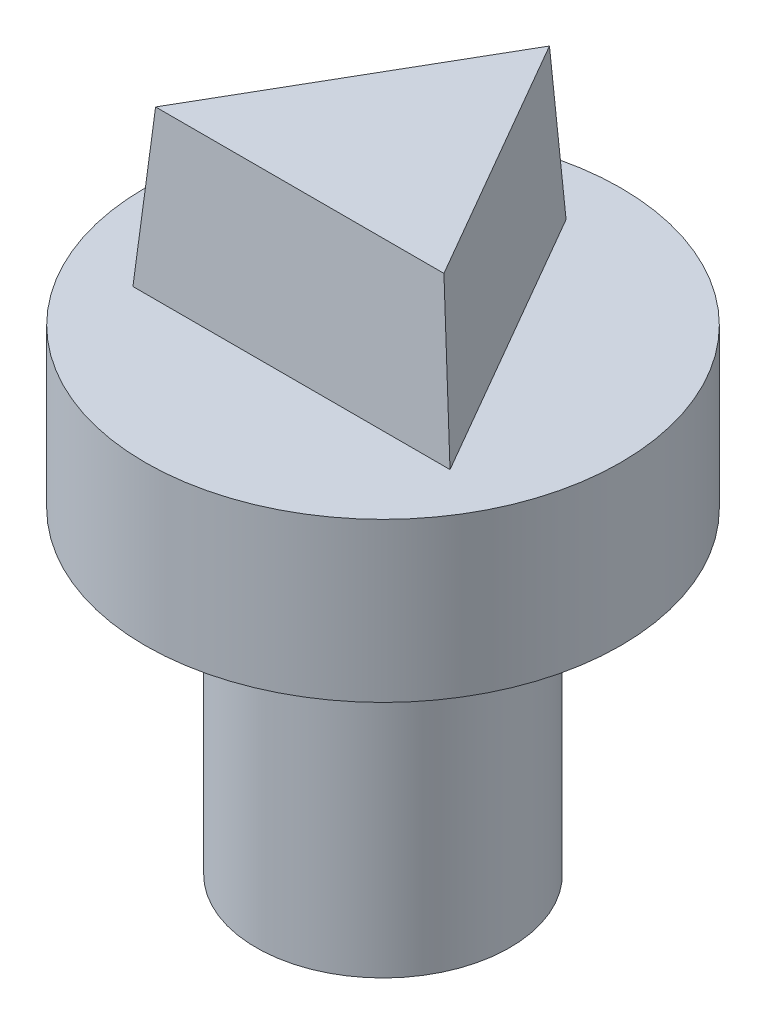
ISO-10303-21;
HEADER;
FILE_DESCRIPTION(('STEP AP214'),'2;1');
FILE_NAME('part.step','',(''),(''),'','','');
FILE_SCHEMA(('AUTOMOTIVE_DESIGN { 1 0 10303 214 1 1 1 1 }'));
ENDSEC;
DATA;
#1=APPLICATION_CONTEXT('core data for automotive mechanical design processes');
#2=APPLICATION_PROTOCOL_DEFINITION('international standard','automotive_design',2000,#1);
#3=PRODUCT_CONTEXT('',#1,'mechanical');
#4=PRODUCT('Part','Part','',(#3));
#5=PRODUCT_RELATED_PRODUCT_CATEGORY('part','',(#4));
#6=PRODUCT_DEFINITION_FORMATION('','',#4);
#7=PRODUCT_DEFINITION_CONTEXT('part definition',#1,'design');
#8=PRODUCT_DEFINITION('design','',#6,#7);
#9=PRODUCT_DEFINITION_SHAPE('','',#8);
#10=(LENGTH_UNIT() NAMED_UNIT(*) SI_UNIT(.MILLI.,.METRE.));
#11=(NAMED_UNIT(*) PLANE_ANGLE_UNIT() SI_UNIT($,.RADIAN.));
#12=(NAMED_UNIT(*) SI_UNIT($,.STERADIAN.) SOLID_ANGLE_UNIT());
#13=UNCERTAINTY_MEASURE_WITH_UNIT(LENGTH_MEASURE(1.E-05),#10,'distance_accuracy_value','');
#14=(GEOMETRIC_REPRESENTATION_CONTEXT(3) GLOBAL_UNCERTAINTY_ASSIGNED_CONTEXT((#13)) GLOBAL_UNIT_ASSIGNED_CONTEXT((#10,
#11,#12)) REPRESENTATION_CONTEXT('',''));
#15=CARTESIAN_POINT('',(0.,0.,0.));
#16=DIRECTION('',(0.,0.,1.));
#17=DIRECTION('',(1.,0.,0.));
#18=AXIS2_PLACEMENT_3D('',#15,#16,#17);
#19=CARTESIAN_POINT('',(0.,5.,0.));
#20=DIRECTION('',(0.,-1.,0.));
#21=DIRECTION('',(0.,0.,-1.));
#22=AXIS2_PLACEMENT_3D('',#19,#20,#21);
#23=CYLINDRICAL_SURFACE('',#22,7.5);
#24=CARTESIAN_POINT('',(0.,5.,0.));
#25=DIRECTION('',(0.,1.,0.));
#26=DIRECTION('',(0.,0.,1.));
#27=AXIS2_PLACEMENT_3D('',#24,#25,#26);
#28=CIRCLE('',#27,7.5);
#29=CARTESIAN_POINT('',(0.,5.,7.5));
#30=VERTEX_POINT('',#29);
#31=EDGE_CURVE('E45',#30,#30,#28,.T.);
#32=ORIENTED_EDGE('',*,*,#31,.F.);
#33=EDGE_LOOP('',(#32));
#34=FACE_BOUND('',#33,.T.);
#35=CARTESIAN_POINT('',(0.,0.,0.));
#36=DIRECTION('',(0.,1.,0.));
#37=DIRECTION('',(0.,0.,1.));
#38=AXIS2_PLACEMENT_3D('',#35,#36,#37);
#39=CIRCLE('',#38,7.5);
#40=CARTESIAN_POINT('',(0.,0.,7.5));
#41=VERTEX_POINT('',#40);
#42=EDGE_CURVE('E40',#41,#41,#39,.T.);
#43=ORIENTED_EDGE('',*,*,#42,.T.);
#44=EDGE_LOOP('',(#43));
#45=FACE_BOUND('',#44,.T.);
#46=ADVANCED_FACE('F37',(#34,#45),#23,.T.);
#47=CARTESIAN_POINT('',(0.,5.,0.));
#48=DIRECTION('',(0.,1.,0.));
#49=DIRECTION('',(0.,0.,1.));
#50=AXIS2_PLACEMENT_3D('',#47,#48,#49);
#51=PLANE('',#50);
#52=DIRECTION('',(-0.5,0.,-0.866025403784438));
#53=VECTOR('',#52,1.);
#54=CARTESIAN_POINT('',(5.,5.,2.88675134594813));
#55=LINE('',#54,#53);
#56=CARTESIAN_POINT('',(5.,5.,2.88675134594813));
#57=VERTEX_POINT('',#56);
#58=CARTESIAN_POINT('',(0.,5.,-5.77350269189626));
#59=VERTEX_POINT('',#58);
#60=EDGE_CURVE('E53',#57,#59,#55,.T.);
#61=ORIENTED_EDGE('',*,*,#60,.F.);
#62=DIRECTION('',(1.,0.,0.));
#63=VECTOR('',#62,1.);
#64=CARTESIAN_POINT('',(-5.,5.,2.88675134594813));
#65=LINE('',#64,#63);
#66=CARTESIAN_POINT('',(-5.,5.,2.88675134594813));
#67=VERTEX_POINT('',#66);
#68=EDGE_CURVE('E69',#67,#57,#65,.T.);
#69=ORIENTED_EDGE('',*,*,#68,.F.);
#70=DIRECTION('',(-0.5,0.,0.866025403784439));
#71=VECTOR('',#70,1.);
#72=CARTESIAN_POINT('',(0.,5.,-5.77350269189626));
#73=LINE('',#72,#71);
#74=EDGE_CURVE('E57',#59,#67,#73,.T.);
#75=ORIENTED_EDGE('',*,*,#74,.F.);
#76=EDGE_LOOP('',(#61,#69,#75));
#77=FACE_BOUND('',#76,.T.);
#78=ORIENTED_EDGE('',*,*,#31,.T.);
#79=EDGE_LOOP('',(#78));
#80=FACE_BOUND('',#79,.T.);
#81=ADVANCED_FACE('F70',(#77,#80),#51,.T.);
#82=CARTESIAN_POINT('',(0.,0.,0.));
#83=DIRECTION('',(0.,1.,0.));
#84=DIRECTION('',(0.,0.,1.));
#85=AXIS2_PLACEMENT_3D('',#82,#83,#84);
#86=PLANE('',#85);
#87=CARTESIAN_POINT('',(0.,0.,0.));
#88=DIRECTION('',(0.,-1.,0.));
#89=DIRECTION('',(0.,0.,-1.));
#90=AXIS2_PLACEMENT_3D('',#87,#88,#89);
#91=CIRCLE('',#90,4.);
#92=CARTESIAN_POINT('',(0.,0.,-4.));
#93=VERTEX_POINT('',#92);
#94=EDGE_CURVE('E11',#93,#93,#91,.T.);
#95=ORIENTED_EDGE('',*,*,#94,.F.);
#96=EDGE_LOOP('',(#95));
#97=FACE_BOUND('',#96,.T.);
#98=ORIENTED_EDGE('',*,*,#42,.F.);
#99=EDGE_LOOP('',(#98));
#100=FACE_BOUND('',#99,.T.);
#101=ADVANCED_FACE('F103',(#97,#100),#86,.F.);
#102=CARTESIAN_POINT('',(5.,5.,2.88675134594813));
#103=DIRECTION('',(0.864838546066896,0.0523359562429439,-0.499314767377287));
#104=DIRECTION('',(-0.5,0.,-0.866025403784438));
#105=AXIS2_PLACEMENT_3D('',#102,#103,#104);
#106=PLANE('',#105);
#107=ORIENTED_EDGE('',*,*,#60,.T.);
#108=DIRECTION('',(0.,-0.994551700956488,-0.104244492058602));
#109=VECTOR('',#108,1.);
#110=CARTESIAN_POINT('',(0.,5.,-5.77350269189626));
#111=LINE('',#110,#109);
#112=CARTESIAN_POINT('',(0.,10.,-5.24942489906585));
#113=VERTEX_POINT('',#112);
#114=EDGE_CURVE('E84',#113,#59,#111,.T.);
#115=ORIENTED_EDGE('',*,*,#114,.F.);
#116=DIRECTION('',(0.5,0.,0.866025403784438));
#117=VECTOR('',#116,1.);
#118=CARTESIAN_POINT('',(4.7730676589248,10.,3.01777079415573));
#119=LINE('',#118,#117);
#120=CARTESIAN_POINT('',(4.54613531784959,10.,2.62471244953292));
#121=VERTEX_POINT('',#120);
#122=EDGE_CURVE('E76',#121,#113,#119,.F.);
#123=ORIENTED_EDGE('',*,*,#122,.F.);
#124=DIRECTION('',(0.0902783783273545,-0.994551700956488,0.052122246029301));
#125=VECTOR('',#124,1.);
#126=CARTESIAN_POINT('',(5.,5.,2.88675134594813));
#127=LINE('',#126,#125);
#128=EDGE_CURVE('E88',#121,#57,#127,.T.);
#129=ORIENTED_EDGE('',*,*,#128,.T.);
#130=EDGE_LOOP('',(#107,#115,#123,#129));
#131=FACE_BOUND('',#130,.T.);
#132=ADVANCED_FACE('F105',(#131),#106,.T.);
#133=CARTESIAN_POINT('',(0.,5.,-5.77350269189626));
#134=DIRECTION('',(-0.864838546066896,0.0523359562429439,-0.499314767377287));
#135=DIRECTION('',(-0.5,0.,0.866025403784439));
#136=AXIS2_PLACEMENT_3D('',#133,#134,#135);
#137=PLANE('',#136);
#138=ORIENTED_EDGE('',*,*,#74,.T.);
#139=DIRECTION('',(-0.0902783783273544,-0.994551700956488,0.052122246029301));
#140=VECTOR('',#139,1.);
#141=CARTESIAN_POINT('',(-5.,5.,2.88675134594813));
#142=LINE('',#141,#140);
#143=CARTESIAN_POINT('',(-4.54613531784959,10.,2.62471244953292));
#144=VERTEX_POINT('',#143);
#145=EDGE_CURVE('E81',#144,#67,#142,.T.);
#146=ORIENTED_EDGE('',*,*,#145,.F.);
#147=DIRECTION('',(0.5,0.,-0.866025403784439));
#148=VECTOR('',#147,1.);
#149=CARTESIAN_POINT('',(0.226932341075205,10.,-5.64248324368866));
#150=LINE('',#149,#148);
#151=EDGE_CURVE('E95',#113,#144,#150,.F.);
#152=ORIENTED_EDGE('',*,*,#151,.F.);
#153=ORIENTED_EDGE('',*,*,#114,.T.);
#154=EDGE_LOOP('',(#138,#146,#152,#153));
#155=FACE_BOUND('',#154,.T.);
#156=ADVANCED_FACE('F80',(#155),#137,.T.);
#157=CARTESIAN_POINT('',(-5.,5.,2.88675134594813));
#158=DIRECTION('',(0.,0.0523359562429439,0.998629534754574));
#159=DIRECTION('',(0.,-0.998629534754574,0.052335956242944));
#160=AXIS2_PLACEMENT_3D('',#157,#158,#159);
#161=PLANE('',#160);
#162=ORIENTED_EDGE('',*,*,#68,.T.);
#163=ORIENTED_EDGE('',*,*,#128,.F.);
#164=DIRECTION('',(-1.,0.,0.));
#165=VECTOR('',#164,1.);
#166=CARTESIAN_POINT('',(-5.,10.,2.62471244953292));
#167=LINE('',#166,#165);
#168=EDGE_CURVE('E87',#144,#121,#167,.F.);
#169=ORIENTED_EDGE('',*,*,#168,.F.);
#170=ORIENTED_EDGE('',*,*,#145,.T.);
#171=EDGE_LOOP('',(#162,#163,#169,#170));
#172=FACE_BOUND('',#171,.T.);
#173=ADVANCED_FACE('F86',(#172),#161,.T.);
#174=CARTESIAN_POINT('',(0.,10.,0.));
#175=DIRECTION('',(0.,1.,0.));
#176=DIRECTION('',(0.,0.,1.));
#177=AXIS2_PLACEMENT_3D('',#174,#175,#176);
#178=PLANE('',#177);
#179=ORIENTED_EDGE('',*,*,#122,.T.);
#180=ORIENTED_EDGE('',*,*,#151,.T.);
#181=ORIENTED_EDGE('',*,*,#168,.T.);
#182=EDGE_LOOP('',(#179,#180,#181));
#183=FACE_BOUND('',#182,.T.);
#184=ADVANCED_FACE('F150',(#183),#178,.T.);
#185=CARTESIAN_POINT('',(0.,-10.,0.));
#186=DIRECTION('',(0.,1.,0.));
#187=DIRECTION('',(0.,0.,1.));
#188=AXIS2_PLACEMENT_3D('',#185,#186,#187);
#189=CYLINDRICAL_SURFACE('',#188,4.);
#190=CARTESIAN_POINT('',(0.,-10.,0.));
#191=DIRECTION('',(0.,-1.,0.));
#192=DIRECTION('',(0.,0.,-1.));
#193=AXIS2_PLACEMENT_3D('',#190,#191,#192);
#194=CIRCLE('',#193,4.);
#195=CARTESIAN_POINT('',(0.,-10.,-4.));
#196=VERTEX_POINT('',#195);
#197=EDGE_CURVE('E205',#196,#196,#194,.T.);
#198=ORIENTED_EDGE('',*,*,#197,.F.);
#199=EDGE_LOOP('',(#198));
#200=FACE_BOUND('',#199,.T.);
#201=ORIENTED_EDGE('',*,*,#94,.T.);
#202=EDGE_LOOP('',(#201));
#203=FACE_BOUND('',#202,.T.);
#204=ADVANCED_FACE('F159',(#200,#203),#189,.T.);
#205=CARTESIAN_POINT('',(0.,-10.,0.));
#206=DIRECTION('',(0.,-1.,0.));
#207=DIRECTION('',(0.,0.,-1.));
#208=AXIS2_PLACEMENT_3D('',#205,#206,#207);
#209=PLANE('',#208);
#210=ORIENTED_EDGE('',*,*,#197,.T.);
#211=EDGE_LOOP('',(#210));
#212=FACE_BOUND('',#211,.T.);
#213=ADVANCED_FACE('F175',(#212),#209,.T.);
#214=CLOSED_SHELL('',(#46,#81,#101,#132,#156,#173,#184,#204,#213));
#215=MANIFOLD_SOLID_BREP('B2',#214);
#216=ADVANCED_BREP_SHAPE_REPRESENTATION('',(#18,#215),#14);
#217=SHAPE_DEFINITION_REPRESENTATION(#9,#216);
ENDSEC;
END-ISO-10303-21;
